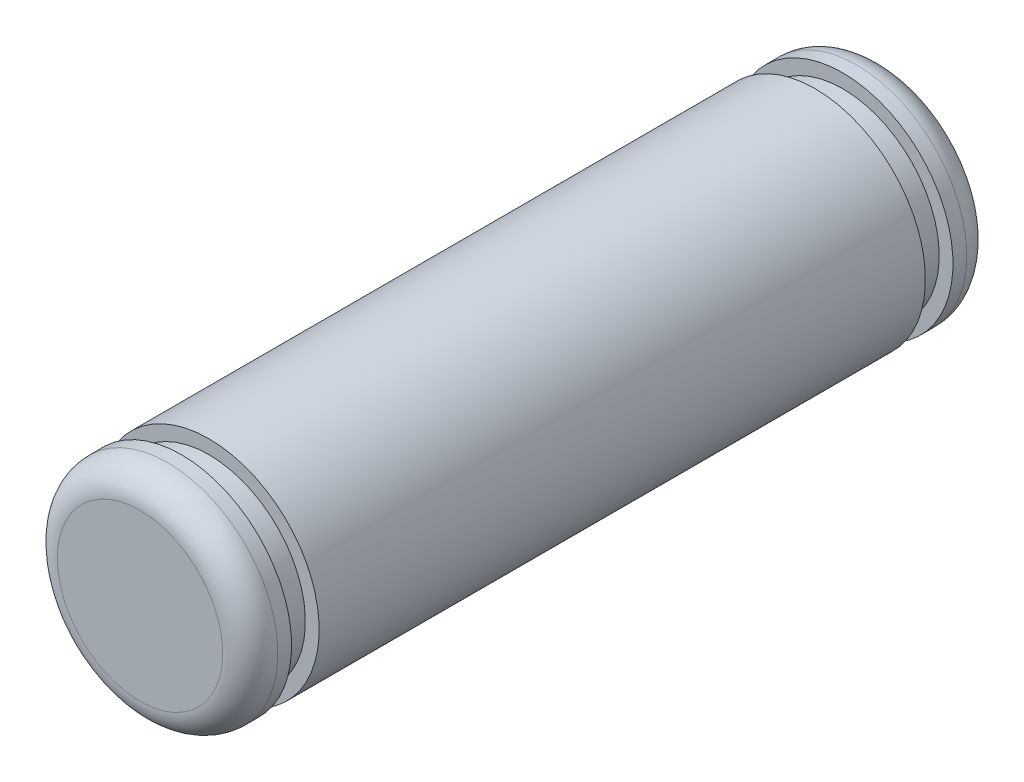
ISO-10303-21;
HEADER;
FILE_DESCRIPTION(('STEP AP214'),'2;1');
FILE_NAME('part.step','',(''),(''),'','','');
FILE_SCHEMA(('AUTOMOTIVE_DESIGN { 1 0 10303 214 1 1 1 1 }'));
ENDSEC;
DATA;
#1=APPLICATION_CONTEXT('core data for automotive mechanical design processes');
#2=APPLICATION_PROTOCOL_DEFINITION('international standard','automotive_design',2000,#1);
#3=PRODUCT_CONTEXT('',#1,'mechanical');
#4=PRODUCT('Part','Part','',(#3));
#5=PRODUCT_RELATED_PRODUCT_CATEGORY('part','',(#4));
#6=PRODUCT_DEFINITION_FORMATION('','',#4);
#7=PRODUCT_DEFINITION_CONTEXT('part definition',#1,'design');
#8=PRODUCT_DEFINITION('design','',#6,#7);
#9=PRODUCT_DEFINITION_SHAPE('','',#8);
#10=(LENGTH_UNIT() NAMED_UNIT(*) SI_UNIT(.MILLI.,.METRE.));
#11=(NAMED_UNIT(*) PLANE_ANGLE_UNIT() SI_UNIT($,.RADIAN.));
#12=(NAMED_UNIT(*) SI_UNIT($,.STERADIAN.) SOLID_ANGLE_UNIT());
#13=UNCERTAINTY_MEASURE_WITH_UNIT(LENGTH_MEASURE(1.E-05),#10,'distance_accuracy_value','');
#14=(GEOMETRIC_REPRESENTATION_CONTEXT(3) GLOBAL_UNCERTAINTY_ASSIGNED_CONTEXT((#13)) GLOBAL_UNIT_ASSIGNED_CONTEXT((#10,
#11,#12)) REPRESENTATION_CONTEXT('',''));
#15=CARTESIAN_POINT('',(0.,0.,0.));
#16=DIRECTION('',(0.,0.,1.));
#17=DIRECTION('',(1.,0.,0.));
#18=AXIS2_PLACEMENT_3D('',#15,#16,#17);
#19=CARTESIAN_POINT('',(194.,1.5,13.5));
#20=DIRECTION('',(0.,0.,1.));
#21=DIRECTION('',(0.,1.,0.));
#22=AXIS2_PLACEMENT_3D('',#19,#20,#21);
#23=PLANE('',#22);
#24=CARTESIAN_POINT('',(194.,0.,13.5));
#25=DIRECTION('',(0.,0.,1.));
#26=DIRECTION('',(0.,1.,0.));
#27=AXIS2_PLACEMENT_3D('',#24,#25,#26);
#28=CIRCLE('',#27,3.);
#29=CARTESIAN_POINT('',(194.,3.,13.5));
#30=VERTEX_POINT('',#29);
#31=EDGE_CURVE('E11',#30,#30,#28,.T.);
#32=ORIENTED_EDGE('',*,*,#31,.T.);
#33=EDGE_LOOP('',(#32));
#34=FACE_BOUND('',#33,.T.);
#35=ADVANCED_FACE('F16',(#34),#23,.T.);
#36=CARTESIAN_POINT('',(194.,0.,12.5));
#37=DIRECTION('',(0.,0.,1.));
#38=DIRECTION('',(1.,0.,0.));
#39=AXIS2_PLACEMENT_3D('',#36,#37,#38);
#40=TOROIDAL_SURFACE('',#39,3.,1.);
#41=CARTESIAN_POINT('',(194.,0.,12.5));
#42=DIRECTION('',(0.,0.,1.));
#43=DIRECTION('',(0.,1.,0.));
#44=AXIS2_PLACEMENT_3D('',#41,#42,#43);
#45=CIRCLE('',#44,4.);
#46=CARTESIAN_POINT('',(194.,4.,12.5));
#47=VERTEX_POINT('',#46);
#48=EDGE_CURVE('E20',#47,#47,#45,.T.);
#49=ORIENTED_EDGE('',*,*,#48,.T.);
#50=EDGE_LOOP('',(#49));
#51=FACE_BOUND('',#50,.T.);
#52=ORIENTED_EDGE('',*,*,#31,.F.);
#53=EDGE_LOOP('',(#52));
#54=FACE_BOUND('',#53,.T.);
#55=ADVANCED_FACE('F18',(#51,#54),#40,.T.);
#56=CARTESIAN_POINT('',(194.,0.,12.25));
#57=DIRECTION('',(0.,0.,-1.));
#58=DIRECTION('',(0.,1.,0.));
#59=AXIS2_PLACEMENT_3D('',#56,#57,#58);
#60=CYLINDRICAL_SURFACE('',#59,4.);
#61=CARTESIAN_POINT('',(194.,0.,12.));
#62=DIRECTION('',(0.,0.,1.));
#63=DIRECTION('',(0.,1.,0.));
#64=AXIS2_PLACEMENT_3D('',#61,#62,#63);
#65=CIRCLE('',#64,4.);
#66=CARTESIAN_POINT('',(194.,4.,12.));
#67=VERTEX_POINT('',#66);
#68=EDGE_CURVE('E70',#67,#67,#65,.T.);
#69=ORIENTED_EDGE('',*,*,#68,.T.);
#70=EDGE_LOOP('',(#69));
#71=FACE_BOUND('',#70,.T.);
#72=ORIENTED_EDGE('',*,*,#48,.F.);
#73=EDGE_LOOP('',(#72));
#74=FACE_BOUND('',#73,.T.);
#75=ADVANCED_FACE('F109',(#71,#74),#60,.T.);
#76=CARTESIAN_POINT('',(194.,3.75,12.));
#77=DIRECTION('',(0.,0.,-1.));
#78=DIRECTION('',(0.,-1.,0.));
#79=AXIS2_PLACEMENT_3D('',#76,#77,#78);
#80=PLANE('',#79);
#81=CARTESIAN_POINT('',(194.,0.,12.));
#82=DIRECTION('',(0.,0.,1.));
#83=DIRECTION('',(0.,1.,0.));
#84=AXIS2_PLACEMENT_3D('',#81,#82,#83);
#85=CIRCLE('',#84,3.5);
#86=CARTESIAN_POINT('',(194.,3.5,12.));
#87=VERTEX_POINT('',#86);
#88=EDGE_CURVE('E66',#87,#87,#85,.T.);
#89=ORIENTED_EDGE('',*,*,#88,.T.);
#90=EDGE_LOOP('',(#89));
#91=FACE_BOUND('',#90,.T.);
#92=ORIENTED_EDGE('',*,*,#68,.F.);
#93=EDGE_LOOP('',(#92));
#94=FACE_BOUND('',#93,.T.);
#95=ADVANCED_FACE('F67',(#91,#94),#80,.T.);
#96=CARTESIAN_POINT('',(194.,0.,11.5));
#97=DIRECTION('',(0.,0.,-1.));
#98=DIRECTION('',(0.,1.,0.));
#99=AXIS2_PLACEMENT_3D('',#96,#97,#98);
#100=CYLINDRICAL_SURFACE('',#99,3.5);
#101=CARTESIAN_POINT('',(194.,0.,11.));
#102=DIRECTION('',(0.,0.,1.));
#103=DIRECTION('',(0.,1.,0.));
#104=AXIS2_PLACEMENT_3D('',#101,#102,#103);
#105=CIRCLE('',#104,3.5);
#106=CARTESIAN_POINT('',(194.,3.5,11.));
#107=VERTEX_POINT('',#106);
#108=EDGE_CURVE('E62',#107,#107,#105,.T.);
#109=ORIENTED_EDGE('',*,*,#108,.T.);
#110=EDGE_LOOP('',(#109));
#111=FACE_BOUND('',#110,.T.);
#112=ORIENTED_EDGE('',*,*,#88,.F.);
#113=EDGE_LOOP('',(#112));
#114=FACE_BOUND('',#113,.T.);
#115=ADVANCED_FACE('F124',(#111,#114),#100,.T.);
#116=CARTESIAN_POINT('',(194.,3.75,11.));
#117=DIRECTION('',(0.,0.,1.));
#118=DIRECTION('',(0.,1.,0.));
#119=AXIS2_PLACEMENT_3D('',#116,#117,#118);
#120=PLANE('',#119);
#121=CARTESIAN_POINT('',(194.,0.,11.));
#122=DIRECTION('',(0.,0.,1.));
#123=DIRECTION('',(0.,1.,0.));
#124=AXIS2_PLACEMENT_3D('',#121,#122,#123);
#125=CIRCLE('',#124,4.);
#126=CARTESIAN_POINT('',(194.,4.,11.));
#127=VERTEX_POINT('',#126);
#128=EDGE_CURVE('E72',#127,#127,#125,.T.);
#129=ORIENTED_EDGE('',*,*,#128,.T.);
#130=EDGE_LOOP('',(#129));
#131=FACE_BOUND('',#130,.T.);
#132=ORIENTED_EDGE('',*,*,#108,.F.);
#133=EDGE_LOOP('',(#132));
#134=FACE_BOUND('',#133,.T.);
#135=ADVANCED_FACE('F121',(#131,#134),#120,.T.);
#136=CARTESIAN_POINT('',(194.,0.,0.));
#137=DIRECTION('',(0.,0.,-1.));
#138=DIRECTION('',(0.,1.,0.));
#139=AXIS2_PLACEMENT_3D('',#136,#137,#138);
#140=CYLINDRICAL_SURFACE('',#139,4.);
#141=CARTESIAN_POINT('',(194.,0.,-11.));
#142=DIRECTION('',(0.,0.,1.));
#143=DIRECTION('',(0.,1.,0.));
#144=AXIS2_PLACEMENT_3D('',#141,#142,#143);
#145=CIRCLE('',#144,4.);
#146=CARTESIAN_POINT('',(194.,4.,-11.));
#147=VERTEX_POINT('',#146);
#148=EDGE_CURVE('E76',#147,#147,#145,.T.);
#149=ORIENTED_EDGE('',*,*,#148,.T.);
#150=EDGE_LOOP('',(#149));
#151=FACE_BOUND('',#150,.T.);
#152=ORIENTED_EDGE('',*,*,#128,.F.);
#153=EDGE_LOOP('',(#152));
#154=FACE_BOUND('',#153,.T.);
#155=ADVANCED_FACE('F117',(#151,#154),#140,.T.);
#156=CARTESIAN_POINT('',(194.,3.75,-11.));
#157=DIRECTION('',(0.,0.,-1.));
#158=DIRECTION('',(0.,-1.,0.));
#159=AXIS2_PLACEMENT_3D('',#156,#157,#158);
#160=PLANE('',#159);
#161=CARTESIAN_POINT('',(194.,0.,-11.));
#162=DIRECTION('',(0.,0.,1.));
#163=DIRECTION('',(0.,1.,0.));
#164=AXIS2_PLACEMENT_3D('',#161,#162,#163);
#165=CIRCLE('',#164,3.5);
#166=CARTESIAN_POINT('',(194.,3.5,-11.));
#167=VERTEX_POINT('',#166);
#168=EDGE_CURVE('E78',#167,#167,#165,.T.);
#169=ORIENTED_EDGE('',*,*,#168,.T.);
#170=EDGE_LOOP('',(#169));
#171=FACE_BOUND('',#170,.T.);
#172=ORIENTED_EDGE('',*,*,#148,.F.);
#173=EDGE_LOOP('',(#172));
#174=FACE_BOUND('',#173,.T.);
#175=ADVANCED_FACE('F114',(#171,#174),#160,.T.);
#176=CARTESIAN_POINT('',(194.,0.,-11.5));
#177=DIRECTION('',(0.,0.,-1.));
#178=DIRECTION('',(0.,1.,0.));
#179=AXIS2_PLACEMENT_3D('',#176,#177,#178);
#180=CYLINDRICAL_SURFACE('',#179,3.5);
#181=CARTESIAN_POINT('',(194.,0.,-12.));
#182=DIRECTION('',(0.,0.,1.));
#183=DIRECTION('',(0.,1.,0.));
#184=AXIS2_PLACEMENT_3D('',#181,#182,#183);
#185=CIRCLE('',#184,3.5);
#186=CARTESIAN_POINT('',(194.,3.5,-12.));
#187=VERTEX_POINT('',#186);
#188=EDGE_CURVE('E79',#187,#187,#185,.T.);
#189=ORIENTED_EDGE('',*,*,#188,.T.);
#190=EDGE_LOOP('',(#189));
#191=FACE_BOUND('',#190,.T.);
#192=ORIENTED_EDGE('',*,*,#168,.F.);
#193=EDGE_LOOP('',(#192));
#194=FACE_BOUND('',#193,.T.);
#195=ADVANCED_FACE('F112',(#191,#194),#180,.T.);
#196=CARTESIAN_POINT('',(194.,3.75,-12.));
#197=DIRECTION('',(0.,0.,1.));
#198=DIRECTION('',(0.,1.,0.));
#199=AXIS2_PLACEMENT_3D('',#196,#197,#198);
#200=PLANE('',#199);
#201=CARTESIAN_POINT('',(194.,0.,-12.));
#202=DIRECTION('',(0.,0.,1.));
#203=DIRECTION('',(0.,1.,0.));
#204=AXIS2_PLACEMENT_3D('',#201,#202,#203);
#205=CIRCLE('',#204,4.);
#206=CARTESIAN_POINT('',(194.,4.,-12.));
#207=VERTEX_POINT('',#206);
#208=EDGE_CURVE('E82',#207,#207,#205,.T.);
#209=ORIENTED_EDGE('',*,*,#208,.T.);
#210=EDGE_LOOP('',(#209));
#211=FACE_BOUND('',#210,.T.);
#212=ORIENTED_EDGE('',*,*,#188,.F.);
#213=EDGE_LOOP('',(#212));
#214=FACE_BOUND('',#213,.T.);
#215=ADVANCED_FACE('F164',(#211,#214),#200,.T.);
#216=CARTESIAN_POINT('',(194.,0.,-12.25));
#217=DIRECTION('',(0.,0.,-1.));
#218=DIRECTION('',(0.,1.,0.));
#219=AXIS2_PLACEMENT_3D('',#216,#217,#218);
#220=CYLINDRICAL_SURFACE('',#219,4.);
#221=CARTESIAN_POINT('',(194.,0.,-12.5));
#222=DIRECTION('',(0.,0.,1.));
#223=DIRECTION('',(0.,1.,0.));
#224=AXIS2_PLACEMENT_3D('',#221,#222,#223);
#225=CIRCLE('',#224,4.);
#226=CARTESIAN_POINT('',(194.,4.,-12.5));
#227=VERTEX_POINT('',#226);
#228=EDGE_CURVE('E84',#227,#227,#225,.T.);
#229=ORIENTED_EDGE('',*,*,#228,.T.);
#230=EDGE_LOOP('',(#229));
#231=FACE_BOUND('',#230,.T.);
#232=ORIENTED_EDGE('',*,*,#208,.F.);
#233=EDGE_LOOP('',(#232));
#234=FACE_BOUND('',#233,.T.);
#235=ADVANCED_FACE('F100',(#231,#234),#220,.T.);
#236=CARTESIAN_POINT('',(194.,0.,-12.5));
#237=DIRECTION('',(0.,0.,1.));
#238=DIRECTION('',(1.,0.,0.));
#239=AXIS2_PLACEMENT_3D('',#236,#237,#238);
#240=TOROIDAL_SURFACE('',#239,3.,1.);
#241=CARTESIAN_POINT('',(194.,0.,-13.5));
#242=DIRECTION('',(0.,0.,1.));
#243=DIRECTION('',(0.,1.,0.));
#244=AXIS2_PLACEMENT_3D('',#241,#242,#243);
#245=CIRCLE('',#244,3.);
#246=CARTESIAN_POINT('',(194.,3.,-13.5));
#247=VERTEX_POINT('',#246);
#248=EDGE_CURVE('E86',#247,#247,#245,.T.);
#249=ORIENTED_EDGE('',*,*,#248,.T.);
#250=EDGE_LOOP('',(#249));
#251=FACE_BOUND('',#250,.T.);
#252=ORIENTED_EDGE('',*,*,#228,.F.);
#253=EDGE_LOOP('',(#252));
#254=FACE_BOUND('',#253,.T.);
#255=ADVANCED_FACE('F90',(#251,#254),#240,.T.);
#256=CARTESIAN_POINT('',(194.,1.5,-13.5));
#257=DIRECTION('',(0.,0.,-1.));
#258=DIRECTION('',(0.,-1.,0.));
#259=AXIS2_PLACEMENT_3D('',#256,#257,#258);
#260=PLANE('',#259);
#261=ORIENTED_EDGE('',*,*,#248,.F.);
#262=EDGE_LOOP('',(#261));
#263=FACE_BOUND('',#262,.T.);
#264=ADVANCED_FACE('F93',(#263),#260,.T.);
#265=CLOSED_SHELL('',(#35,#55,#75,#95,#115,#135,#155,#175,#195,#215,#235,#255,#264));
#266=MANIFOLD_SOLID_BREP('B1',#265);
#267=ADVANCED_BREP_SHAPE_REPRESENTATION('',(#18,#266),#14);
#268=SHAPE_DEFINITION_REPRESENTATION(#9,#267);
ENDSEC;
END-ISO-10303-21;
